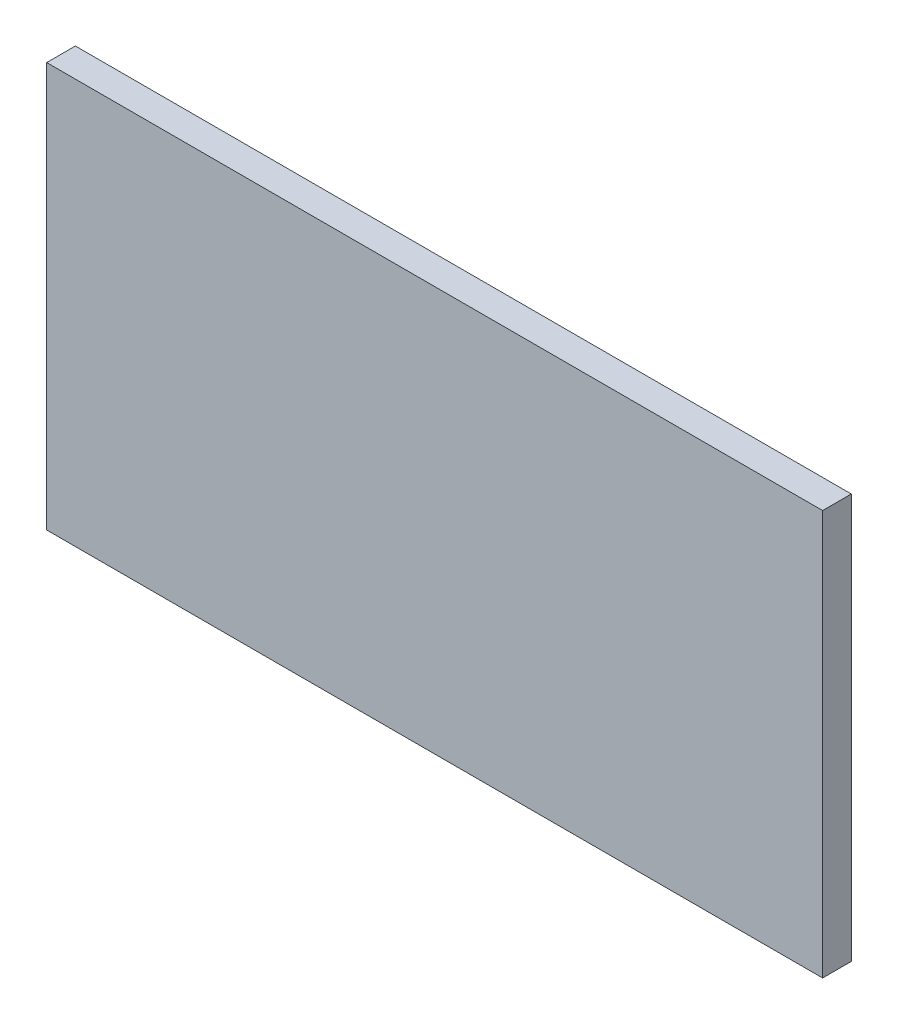
ISO-10303-21;
HEADER;
FILE_DESCRIPTION(('STEP AP214'),'2;1');
FILE_NAME('part.step','',(''),(''),'','','');
FILE_SCHEMA(('AUTOMOTIVE_DESIGN { 1 0 10303 214 1 1 1 1 }'));
ENDSEC;
DATA;
#1=APPLICATION_CONTEXT('core data for automotive mechanical design processes');
#2=APPLICATION_PROTOCOL_DEFINITION('international standard','automotive_design',2000,#1);
#3=PRODUCT_CONTEXT('',#1,'mechanical');
#4=PRODUCT('Part','Part','',(#3));
#5=PRODUCT_RELATED_PRODUCT_CATEGORY('part','',(#4));
#6=PRODUCT_DEFINITION_FORMATION('','',#4);
#7=PRODUCT_DEFINITION_CONTEXT('part definition',#1,'design');
#8=PRODUCT_DEFINITION('design','',#6,#7);
#9=PRODUCT_DEFINITION_SHAPE('','',#8);
#10=(LENGTH_UNIT() NAMED_UNIT(*) SI_UNIT(.MILLI.,.METRE.));
#11=(NAMED_UNIT(*) PLANE_ANGLE_UNIT() SI_UNIT($,.RADIAN.));
#12=(NAMED_UNIT(*) SI_UNIT($,.STERADIAN.) SOLID_ANGLE_UNIT());
#13=UNCERTAINTY_MEASURE_WITH_UNIT(LENGTH_MEASURE(1.E-05),#10,'distance_accuracy_value','');
#14=(GEOMETRIC_REPRESENTATION_CONTEXT(3) GLOBAL_UNCERTAINTY_ASSIGNED_CONTEXT((#13)) GLOBAL_UNIT_ASSIGNED_CONTEXT((#10,
#11,#12)) REPRESENTATION_CONTEXT('',''));
#15=CARTESIAN_POINT('',(0.,0.,0.));
#16=DIRECTION('',(0.,0.,1.));
#17=DIRECTION('',(1.,0.,0.));
#18=AXIS2_PLACEMENT_3D('',#15,#16,#17);
#19=CARTESIAN_POINT('',(0.,24.,1.7));
#20=DIRECTION('',(1.,0.,0.));
#21=DIRECTION('',(0.,0.,-1.));
#22=AXIS2_PLACEMENT_3D('',#19,#20,#21);
#23=PLANE('',#22);
#24=DIRECTION('',(0.,-1.,0.));
#25=VECTOR('',#24,1.);
#26=CARTESIAN_POINT('',(0.,24.,0.));
#27=LINE('',#26,#25);
#28=CARTESIAN_POINT('',(0.,24.,0.));
#29=VERTEX_POINT('',#28);
#30=CARTESIAN_POINT('',(0.,0.,0.));
#31=VERTEX_POINT('',#30);
#32=EDGE_CURVE('E102',#29,#31,#27,.T.);
#33=ORIENTED_EDGE('',*,*,#32,.T.);
#34=DIRECTION('',(0.,0.,-1.));
#35=VECTOR('',#34,1.);
#36=CARTESIAN_POINT('',(0.,0.,1.7));
#37=LINE('',#36,#35);
#38=CARTESIAN_POINT('',(0.,0.,1.7));
#39=VERTEX_POINT('',#38);
#40=EDGE_CURVE('E11',#39,#31,#37,.T.);
#41=ORIENTED_EDGE('',*,*,#40,.F.);
#42=DIRECTION('',(0.,-1.,0.));
#43=VECTOR('',#42,1.);
#44=CARTESIAN_POINT('',(0.,24.,1.7));
#45=LINE('',#44,#43);
#46=CARTESIAN_POINT('',(0.,24.,1.7));
#47=VERTEX_POINT('',#46);
#48=EDGE_CURVE('E90',#47,#39,#45,.T.);
#49=ORIENTED_EDGE('',*,*,#48,.F.);
#50=DIRECTION('',(0.,0.,-1.));
#51=VECTOR('',#50,1.);
#52=CARTESIAN_POINT('',(0.,24.,1.7));
#53=LINE('',#52,#51);
#54=EDGE_CURVE('E98',#47,#29,#53,.T.);
#55=ORIENTED_EDGE('',*,*,#54,.T.);
#56=EDGE_LOOP('',(#33,#41,#49,#55));
#57=FACE_BOUND('',#56,.T.);
#58=ADVANCED_FACE('F39',(#57),#23,.F.);
#59=CARTESIAN_POINT('',(0.,0.,1.7));
#60=DIRECTION('',(0.,1.,0.));
#61=DIRECTION('',(0.,0.,1.));
#62=AXIS2_PLACEMENT_3D('',#59,#60,#61);
#63=PLANE('',#62);
#64=DIRECTION('',(1.,0.,0.));
#65=VECTOR('',#64,1.);
#66=CARTESIAN_POINT('',(0.,0.,0.));
#67=LINE('',#66,#65);
#68=CARTESIAN_POINT('',(46.,0.,0.));
#69=VERTEX_POINT('',#68);
#70=EDGE_CURVE('E94',#31,#69,#67,.T.);
#71=ORIENTED_EDGE('',*,*,#70,.T.);
#72=DIRECTION('',(0.,0.,-1.));
#73=VECTOR('',#72,1.);
#74=CARTESIAN_POINT('',(46.,0.,1.7));
#75=LINE('',#74,#73);
#76=CARTESIAN_POINT('',(46.,0.,1.7));
#77=VERTEX_POINT('',#76);
#78=EDGE_CURVE('E47',#77,#69,#75,.T.);
#79=ORIENTED_EDGE('',*,*,#78,.F.);
#80=DIRECTION('',(1.,0.,0.));
#81=VECTOR('',#80,1.);
#82=CARTESIAN_POINT('',(0.,0.,1.7));
#83=LINE('',#82,#81);
#84=EDGE_CURVE('E85',#39,#77,#83,.T.);
#85=ORIENTED_EDGE('',*,*,#84,.F.);
#86=ORIENTED_EDGE('',*,*,#40,.T.);
#87=EDGE_LOOP('',(#71,#79,#85,#86));
#88=FACE_BOUND('',#87,.T.);
#89=ADVANCED_FACE('F93',(#88),#63,.F.);
#90=CARTESIAN_POINT('',(46.,0.,1.7));
#91=DIRECTION('',(-1.,0.,0.));
#92=DIRECTION('',(0.,0.,1.));
#93=AXIS2_PLACEMENT_3D('',#90,#91,#92);
#94=PLANE('',#93);
#95=DIRECTION('',(0.,1.,0.));
#96=VECTOR('',#95,1.);
#97=CARTESIAN_POINT('',(46.,0.,0.));
#98=LINE('',#97,#96);
#99=CARTESIAN_POINT('',(46.,24.,0.));
#100=VERTEX_POINT('',#99);
#101=EDGE_CURVE('E72',#69,#100,#98,.T.);
#102=ORIENTED_EDGE('',*,*,#101,.T.);
#103=DIRECTION('',(0.,0.,-1.));
#104=VECTOR('',#103,1.);
#105=CARTESIAN_POINT('',(46.,24.,1.7));
#106=LINE('',#105,#104);
#107=CARTESIAN_POINT('',(46.,24.,1.7));
#108=VERTEX_POINT('',#107);
#109=EDGE_CURVE('E95',#108,#100,#106,.T.);
#110=ORIENTED_EDGE('',*,*,#109,.F.);
#111=DIRECTION('',(0.,1.,0.));
#112=VECTOR('',#111,1.);
#113=CARTESIAN_POINT('',(46.,0.,1.7));
#114=LINE('',#113,#112);
#115=EDGE_CURVE('E88',#77,#108,#114,.T.);
#116=ORIENTED_EDGE('',*,*,#115,.F.);
#117=ORIENTED_EDGE('',*,*,#78,.T.);
#118=EDGE_LOOP('',(#102,#110,#116,#117));
#119=FACE_BOUND('',#118,.T.);
#120=ADVANCED_FACE('F96',(#119),#94,.F.);
#121=CARTESIAN_POINT('',(46.,24.,1.7));
#122=DIRECTION('',(0.,-1.,0.));
#123=DIRECTION('',(0.,0.,-1.));
#124=AXIS2_PLACEMENT_3D('',#121,#122,#123);
#125=PLANE('',#124);
#126=DIRECTION('',(-1.,0.,0.));
#127=VECTOR('',#126,1.);
#128=CARTESIAN_POINT('',(46.,24.,0.));
#129=LINE('',#128,#127);
#130=EDGE_CURVE('E78',#100,#29,#129,.T.);
#131=ORIENTED_EDGE('',*,*,#130,.T.);
#132=ORIENTED_EDGE('',*,*,#54,.F.);
#133=DIRECTION('',(-1.,0.,0.));
#134=VECTOR('',#133,1.);
#135=CARTESIAN_POINT('',(46.,24.,1.7));
#136=LINE('',#135,#134);
#137=EDGE_CURVE('E55',#108,#47,#136,.T.);
#138=ORIENTED_EDGE('',*,*,#137,.F.);
#139=ORIENTED_EDGE('',*,*,#109,.T.);
#140=EDGE_LOOP('',(#131,#132,#138,#139));
#141=FACE_BOUND('',#140,.T.);
#142=ADVANCED_FACE('F109',(#141),#125,.F.);
#143=CARTESIAN_POINT('',(0.,0.,1.7));
#144=DIRECTION('',(0.,0.,1.));
#145=DIRECTION('',(1.,0.,0.));
#146=AXIS2_PLACEMENT_3D('',#143,#144,#145);
#147=PLANE('',#146);
#148=ORIENTED_EDGE('',*,*,#48,.T.);
#149=ORIENTED_EDGE('',*,*,#84,.T.);
#150=ORIENTED_EDGE('',*,*,#115,.T.);
#151=ORIENTED_EDGE('',*,*,#137,.T.);
#152=EDGE_LOOP('',(#148,#149,#150,#151));
#153=FACE_BOUND('',#152,.T.);
#154=ADVANCED_FACE('F86',(#153),#147,.T.);
#155=CARTESIAN_POINT('',(0.,0.,0.));
#156=DIRECTION('',(0.,0.,1.));
#157=DIRECTION('',(1.,0.,0.));
#158=AXIS2_PLACEMENT_3D('',#155,#156,#157);
#159=PLANE('',#158);
#160=ORIENTED_EDGE('',*,*,#32,.F.);
#161=ORIENTED_EDGE('',*,*,#130,.F.);
#162=ORIENTED_EDGE('',*,*,#101,.F.);
#163=ORIENTED_EDGE('',*,*,#70,.F.);
#164=EDGE_LOOP('',(#160,#161,#162,#163));
#165=FACE_BOUND('',#164,.T.);
#166=ADVANCED_FACE('F112',(#165),#159,.F.);
#167=CLOSED_SHELL('',(#58,#89,#120,#142,#154,#166));
#168=MANIFOLD_SOLID_BREP('B2',#167);
#169=ADVANCED_BREP_SHAPE_REPRESENTATION('',(#18,#168),#14);
#170=SHAPE_DEFINITION_REPRESENTATION(#9,#169);
ENDSEC;
END-ISO-10303-21;
